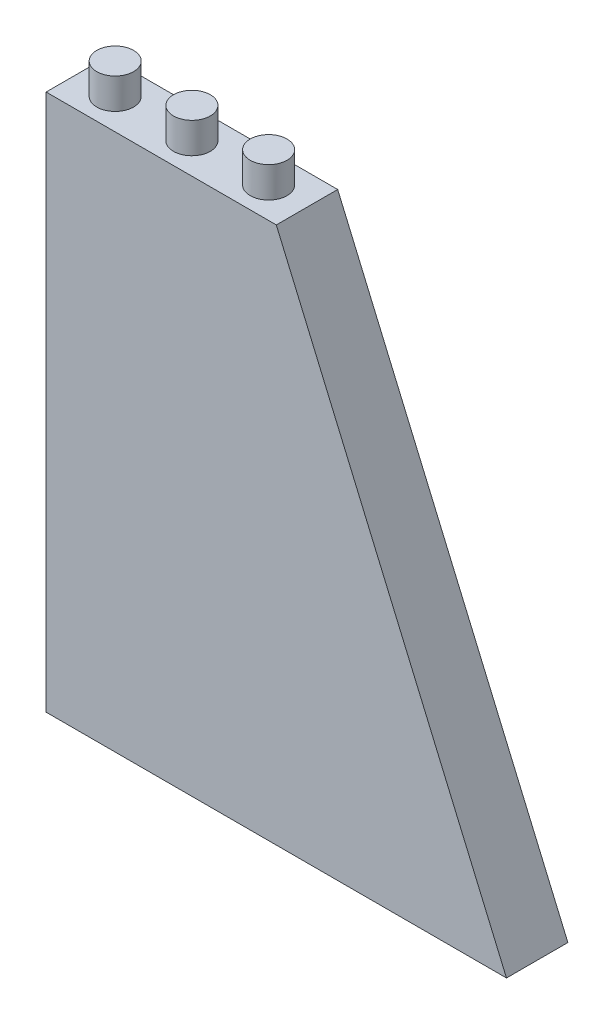
ISO-10303-21;
HEADER;
FILE_DESCRIPTION(('STEP AP214'),'2;1');
FILE_NAME('part.step','',(''),(''),'','','');
FILE_SCHEMA(('AUTOMOTIVE_DESIGN { 1 0 10303 214 1 1 1 1 }'));
ENDSEC;
DATA;
#1=APPLICATION_CONTEXT('core data for automotive mechanical design processes');
#2=APPLICATION_PROTOCOL_DEFINITION('international standard','automotive_design',2000,#1);
#3=PRODUCT_CONTEXT('',#1,'mechanical');
#4=PRODUCT('Part','Part','',(#3));
#5=PRODUCT_RELATED_PRODUCT_CATEGORY('part','',(#4));
#6=PRODUCT_DEFINITION_FORMATION('','',#4);
#7=PRODUCT_DEFINITION_CONTEXT('part definition',#1,'design');
#8=PRODUCT_DEFINITION('design','',#6,#7);
#9=PRODUCT_DEFINITION_SHAPE('','',#8);
#10=(LENGTH_UNIT() NAMED_UNIT(*) SI_UNIT(.MILLI.,.METRE.));
#11=(NAMED_UNIT(*) PLANE_ANGLE_UNIT() SI_UNIT($,.RADIAN.));
#12=(NAMED_UNIT(*) SI_UNIT($,.STERADIAN.) SOLID_ANGLE_UNIT());
#13=UNCERTAINTY_MEASURE_WITH_UNIT(LENGTH_MEASURE(1.E-05),#10,'distance_accuracy_value','');
#14=(GEOMETRIC_REPRESENTATION_CONTEXT(3) GLOBAL_UNCERTAINTY_ASSIGNED_CONTEXT((#13)) GLOBAL_UNIT_ASSIGNED_CONTEXT((#10,
#11,#12)) REPRESENTATION_CONTEXT('',''));
#15=CARTESIAN_POINT('',(0.,0.,0.));
#16=DIRECTION('',(0.,0.,1.));
#17=DIRECTION('',(1.,0.,0.));
#18=AXIS2_PLACEMENT_3D('',#15,#16,#17);
#19=CARTESIAN_POINT('',(60.,0.,8.));
#20=DIRECTION('',(0.,1.,0.));
#21=DIRECTION('',(-1.,0.,0.));
#22=AXIS2_PLACEMENT_3D('',#19,#20,#21);
#23=PLANE('',#22);
#24=DIRECTION('',(1.,0.,0.));
#25=VECTOR('',#24,1.);
#26=CARTESIAN_POINT('',(60.,0.,0.));
#27=LINE('',#26,#25);
#28=CARTESIAN_POINT('',(0.,0.,0.));
#29=VERTEX_POINT('',#28);
#30=CARTESIAN_POINT('',(60.,0.,0.));
#31=VERTEX_POINT('',#30);
#32=EDGE_CURVE('E100',#29,#31,#27,.T.);
#33=ORIENTED_EDGE('',*,*,#32,.T.);
#34=DIRECTION('',(0.,0.,-1.));
#35=VECTOR('',#34,1.);
#36=CARTESIAN_POINT('',(60.,0.,8.));
#37=LINE('',#36,#35);
#38=CARTESIAN_POINT('',(60.,0.,8.));
#39=VERTEX_POINT('',#38);
#40=EDGE_CURVE('E91',#39,#31,#37,.T.);
#41=ORIENTED_EDGE('',*,*,#40,.F.);
#42=DIRECTION('',(1.,0.,0.));
#43=VECTOR('',#42,1.);
#44=CARTESIAN_POINT('',(60.,0.,8.));
#45=LINE('',#44,#43);
#46=CARTESIAN_POINT('',(0.,0.,8.));
#47=VERTEX_POINT('',#46);
#48=EDGE_CURVE('E85',#47,#39,#45,.T.);
#49=ORIENTED_EDGE('',*,*,#48,.F.);
#50=DIRECTION('',(0.,0.,-1.));
#51=VECTOR('',#50,1.);
#52=CARTESIAN_POINT('',(0.,0.,8.));
#53=LINE('',#52,#51);
#54=EDGE_CURVE('E96',#47,#29,#53,.T.);
#55=ORIENTED_EDGE('',*,*,#54,.T.);
#56=EDGE_LOOP('',(#33,#41,#49,#55));
#57=FACE_BOUND('',#56,.T.);
#58=ADVANCED_FACE('F33',(#57),#23,.F.);
#59=CARTESIAN_POINT('',(30.,70.,8.));
#60=DIRECTION('',(-0.919145030018058,-0.393919298579168,0.));
#61=DIRECTION('',(0.393919298579168,-0.919145030018058,0.));
#62=AXIS2_PLACEMENT_3D('',#59,#60,#61);
#63=PLANE('',#62);
#64=DIRECTION('',(-0.393919298579168,0.919145030018058,0.));
#65=VECTOR('',#64,1.);
#66=CARTESIAN_POINT('',(30.,70.,0.));
#67=LINE('',#66,#65);
#68=CARTESIAN_POINT('',(30.,70.,0.));
#69=VERTEX_POINT('',#68);
#70=EDGE_CURVE('E90',#31,#69,#67,.T.);
#71=ORIENTED_EDGE('',*,*,#70,.T.);
#72=DIRECTION('',(0.,0.,-1.));
#73=VECTOR('',#72,1.);
#74=CARTESIAN_POINT('',(30.,70.,8.));
#75=LINE('',#74,#73);
#76=CARTESIAN_POINT('',(30.,70.,8.));
#77=VERTEX_POINT('',#76);
#78=EDGE_CURVE('E88',#77,#69,#75,.T.);
#79=ORIENTED_EDGE('',*,*,#78,.F.);
#80=DIRECTION('',(-0.393919298579168,0.919145030018058,0.));
#81=VECTOR('',#80,1.);
#82=CARTESIAN_POINT('',(30.,70.,8.));
#83=LINE('',#82,#81);
#84=EDGE_CURVE('E80',#39,#77,#83,.T.);
#85=ORIENTED_EDGE('',*,*,#84,.F.);
#86=ORIENTED_EDGE('',*,*,#40,.T.);
#87=EDGE_LOOP('',(#71,#79,#85,#86));
#88=FACE_BOUND('',#87,.T.);
#89=ADVANCED_FACE('F89',(#88),#63,.F.);
#90=CARTESIAN_POINT('',(0.,70.,8.));
#91=DIRECTION('',(0.,-1.,0.));
#92=DIRECTION('',(0.,0.,-1.));
#93=AXIS2_PLACEMENT_3D('',#90,#91,#92);
#94=PLANE('',#93);
#95=CARTESIAN_POINT('',(5.,70.,4.));
#96=DIRECTION('',(0.,-1.,0.));
#97=DIRECTION('',(0.,0.,-1.));
#98=AXIS2_PLACEMENT_3D('',#95,#96,#97);
#99=CIRCLE('',#98,2.4);
#100=CARTESIAN_POINT('',(5.,70.,1.6));
#101=VERTEX_POINT('',#100);
#102=EDGE_CURVE('E11',#101,#101,#99,.F.);
#103=ORIENTED_EDGE('',*,*,#102,.F.);
#104=EDGE_LOOP('',(#103));
#105=FACE_BOUND('',#104,.T.);
#106=CARTESIAN_POINT('',(25.,70.,4.));
#107=DIRECTION('',(0.,-1.,0.));
#108=DIRECTION('',(0.,0.,-1.));
#109=AXIS2_PLACEMENT_3D('',#106,#107,#108);
#110=CIRCLE('',#109,2.4);
#111=CARTESIAN_POINT('',(25.,70.,1.6));
#112=VERTEX_POINT('',#111);
#113=EDGE_CURVE('E41',#112,#112,#110,.F.);
#114=ORIENTED_EDGE('',*,*,#113,.F.);
#115=EDGE_LOOP('',(#114));
#116=FACE_BOUND('',#115,.T.);
#117=CARTESIAN_POINT('',(15.,70.,4.));
#118=DIRECTION('',(0.,1.,0.));
#119=DIRECTION('',(0.,0.,1.));
#120=AXIS2_PLACEMENT_3D('',#117,#118,#119);
#121=CIRCLE('',#120,2.4);
#122=CARTESIAN_POINT('',(15.,70.,6.4));
#123=VERTEX_POINT('',#122);
#124=EDGE_CURVE('E109',#123,#123,#121,.T.);
#125=ORIENTED_EDGE('',*,*,#124,.F.);
#126=EDGE_LOOP('',(#125));
#127=FACE_BOUND('',#126,.T.);
#128=DIRECTION('',(-1.,0.,0.));
#129=VECTOR('',#128,1.);
#130=CARTESIAN_POINT('',(0.,70.,0.));
#131=LINE('',#130,#129);
#132=CARTESIAN_POINT('',(0.,70.,0.));
#133=VERTEX_POINT('',#132);
#134=EDGE_CURVE('E66',#69,#133,#131,.T.);
#135=ORIENTED_EDGE('',*,*,#134,.T.);
#136=DIRECTION('',(0.,0.,-1.));
#137=VECTOR('',#136,1.);
#138=CARTESIAN_POINT('',(0.,70.,8.));
#139=LINE('',#138,#137);
#140=CARTESIAN_POINT('',(0.,70.,8.));
#141=VERTEX_POINT('',#140);
#142=EDGE_CURVE('E92',#141,#133,#139,.T.);
#143=ORIENTED_EDGE('',*,*,#142,.F.);
#144=DIRECTION('',(-1.,0.,0.));
#145=VECTOR('',#144,1.);
#146=CARTESIAN_POINT('',(0.,70.,8.));
#147=LINE('',#146,#145);
#148=EDGE_CURVE('E83',#77,#141,#147,.T.);
#149=ORIENTED_EDGE('',*,*,#148,.F.);
#150=ORIENTED_EDGE('',*,*,#78,.T.);
#151=EDGE_LOOP('',(#135,#143,#149,#150));
#152=FACE_BOUND('',#151,.T.);
#153=ADVANCED_FACE('F94',(#105,#116,#127,#152),#94,.F.);
#154=CARTESIAN_POINT('',(0.,0.,8.));
#155=DIRECTION('',(1.,0.,0.));
#156=DIRECTION('',(0.,0.,-1.));
#157=AXIS2_PLACEMENT_3D('',#154,#155,#156);
#158=PLANE('',#157);
#159=DIRECTION('',(0.,-1.,0.));
#160=VECTOR('',#159,1.);
#161=CARTESIAN_POINT('',(0.,0.,0.));
#162=LINE('',#161,#160);
#163=EDGE_CURVE('E72',#133,#29,#162,.T.);
#164=ORIENTED_EDGE('',*,*,#163,.T.);
#165=ORIENTED_EDGE('',*,*,#54,.F.);
#166=DIRECTION('',(0.,-1.,0.));
#167=VECTOR('',#166,1.);
#168=CARTESIAN_POINT('',(0.,0.,8.));
#169=LINE('',#168,#167);
#170=EDGE_CURVE('E49',#141,#47,#169,.T.);
#171=ORIENTED_EDGE('',*,*,#170,.F.);
#172=ORIENTED_EDGE('',*,*,#142,.T.);
#173=EDGE_LOOP('',(#164,#165,#171,#172));
#174=FACE_BOUND('',#173,.T.);
#175=ADVANCED_FACE('F138',(#174),#158,.F.);
#176=CARTESIAN_POINT('',(0.,0.,8.));
#177=DIRECTION('',(0.,0.,-1.));
#178=DIRECTION('',(-1.,0.,0.));
#179=AXIS2_PLACEMENT_3D('',#176,#177,#178);
#180=PLANE('',#179);
#181=ORIENTED_EDGE('',*,*,#48,.T.);
#182=ORIENTED_EDGE('',*,*,#84,.T.);
#183=ORIENTED_EDGE('',*,*,#148,.T.);
#184=ORIENTED_EDGE('',*,*,#170,.T.);
#185=EDGE_LOOP('',(#181,#182,#183,#184));
#186=FACE_BOUND('',#185,.T.);
#187=ADVANCED_FACE('F81',(#186),#180,.F.);
#188=CARTESIAN_POINT('',(0.,0.,0.));
#189=DIRECTION('',(0.,0.,-1.));
#190=DIRECTION('',(-1.,0.,0.));
#191=AXIS2_PLACEMENT_3D('',#188,#189,#190);
#192=PLANE('',#191);
#193=ORIENTED_EDGE('',*,*,#32,.F.);
#194=ORIENTED_EDGE('',*,*,#163,.F.);
#195=ORIENTED_EDGE('',*,*,#134,.F.);
#196=ORIENTED_EDGE('',*,*,#70,.F.);
#197=EDGE_LOOP('',(#193,#194,#195,#196));
#198=FACE_BOUND('',#197,.T.);
#199=ADVANCED_FACE('F152',(#198),#192,.T.);
#200=CARTESIAN_POINT('',(15.,74.,4.));
#201=DIRECTION('',(0.,-1.,0.));
#202=DIRECTION('',(0.,0.,-1.));
#203=AXIS2_PLACEMENT_3D('',#200,#201,#202);
#204=CYLINDRICAL_SURFACE('',#203,2.4);
#205=CARTESIAN_POINT('',(15.,74.,4.));
#206=DIRECTION('',(0.,1.,0.));
#207=DIRECTION('',(0.,0.,1.));
#208=AXIS2_PLACEMENT_3D('',#205,#206,#207);
#209=CIRCLE('',#208,2.4);
#210=CARTESIAN_POINT('',(15.,74.,6.4));
#211=VERTEX_POINT('',#210);
#212=EDGE_CURVE('E103',#211,#211,#209,.T.);
#213=ORIENTED_EDGE('',*,*,#212,.F.);
#214=EDGE_LOOP('',(#213));
#215=FACE_BOUND('',#214,.T.);
#216=ORIENTED_EDGE('',*,*,#124,.T.);
#217=EDGE_LOOP('',(#216));
#218=FACE_BOUND('',#217,.T.);
#219=ADVANCED_FACE('F154',(#215,#218),#204,.T.);
#220=CARTESIAN_POINT('',(15.,74.,4.));
#221=DIRECTION('',(0.,1.,0.));
#222=DIRECTION('',(0.,0.,1.));
#223=AXIS2_PLACEMENT_3D('',#220,#221,#222);
#224=PLANE('',#223);
#225=ORIENTED_EDGE('',*,*,#212,.T.);
#226=EDGE_LOOP('',(#225));
#227=FACE_BOUND('',#226,.T.);
#228=ADVANCED_FACE('F160',(#227),#224,.T.);
#229=CARTESIAN_POINT('',(25.,74.,4.));
#230=DIRECTION('',(0.,-1.,0.));
#231=DIRECTION('',(0.,0.,-1.));
#232=AXIS2_PLACEMENT_3D('',#229,#230,#231);
#233=CYLINDRICAL_SURFACE('',#232,2.4);
#234=CARTESIAN_POINT('',(25.,74.,4.));
#235=DIRECTION('',(0.,1.,0.));
#236=DIRECTION('',(0.,0.,1.));
#237=AXIS2_PLACEMENT_3D('',#234,#235,#236);
#238=CIRCLE('',#237,2.4);
#239=CARTESIAN_POINT('',(25.,74.,6.4));
#240=VERTEX_POINT('',#239);
#241=EDGE_CURVE('E120',#240,#240,#238,.T.);
#242=ORIENTED_EDGE('',*,*,#241,.F.);
#243=EDGE_LOOP('',(#242));
#244=FACE_BOUND('',#243,.T.);
#245=ORIENTED_EDGE('',*,*,#113,.T.);
#246=EDGE_LOOP('',(#245));
#247=FACE_BOUND('',#246,.T.);
#248=ADVANCED_FACE('F167',(#244,#247),#233,.T.);
#249=CARTESIAN_POINT('',(25.,74.,4.));
#250=DIRECTION('',(0.,1.,0.));
#251=DIRECTION('',(0.,0.,1.));
#252=AXIS2_PLACEMENT_3D('',#249,#250,#251);
#253=PLANE('',#252);
#254=ORIENTED_EDGE('',*,*,#241,.T.);
#255=EDGE_LOOP('',(#254));
#256=FACE_BOUND('',#255,.T.);
#257=ADVANCED_FACE('F132',(#256),#253,.T.);
#258=CARTESIAN_POINT('',(5.,74.,4.));
#259=DIRECTION('',(0.,-1.,0.));
#260=DIRECTION('',(0.,0.,-1.));
#261=AXIS2_PLACEMENT_3D('',#258,#259,#260);
#262=CYLINDRICAL_SURFACE('',#261,2.4);
#263=CARTESIAN_POINT('',(5.,74.,4.));
#264=DIRECTION('',(0.,1.,0.));
#265=DIRECTION('',(0.,0.,1.));
#266=AXIS2_PLACEMENT_3D('',#263,#264,#265);
#267=CIRCLE('',#266,2.4);
#268=CARTESIAN_POINT('',(5.,74.,6.4));
#269=VERTEX_POINT('',#268);
#270=EDGE_CURVE('E123',#269,#269,#267,.T.);
#271=ORIENTED_EDGE('',*,*,#270,.F.);
#272=EDGE_LOOP('',(#271));
#273=FACE_BOUND('',#272,.T.);
#274=ORIENTED_EDGE('',*,*,#102,.T.);
#275=EDGE_LOOP('',(#274));
#276=FACE_BOUND('',#275,.T.);
#277=ADVANCED_FACE('F129',(#273,#276),#262,.T.);
#278=CARTESIAN_POINT('',(5.,74.,4.));
#279=DIRECTION('',(0.,1.,0.));
#280=DIRECTION('',(0.,0.,1.));
#281=AXIS2_PLACEMENT_3D('',#278,#279,#280);
#282=PLANE('',#281);
#283=ORIENTED_EDGE('',*,*,#270,.T.);
#284=EDGE_LOOP('',(#283));
#285=FACE_BOUND('',#284,.T.);
#286=ADVANCED_FACE('F127',(#285),#282,.T.);
#287=CLOSED_SHELL('',(#58,#89,#153,#175,#187,#199,#219,#228,#248,#257,#277,#286));
#288=MANIFOLD_SOLID_BREP('B2',#287);
#289=ADVANCED_BREP_SHAPE_REPRESENTATION('',(#18,#288),#14);
#290=SHAPE_DEFINITION_REPRESENTATION(#9,#289);
ENDSEC;
END-ISO-10303-21;
